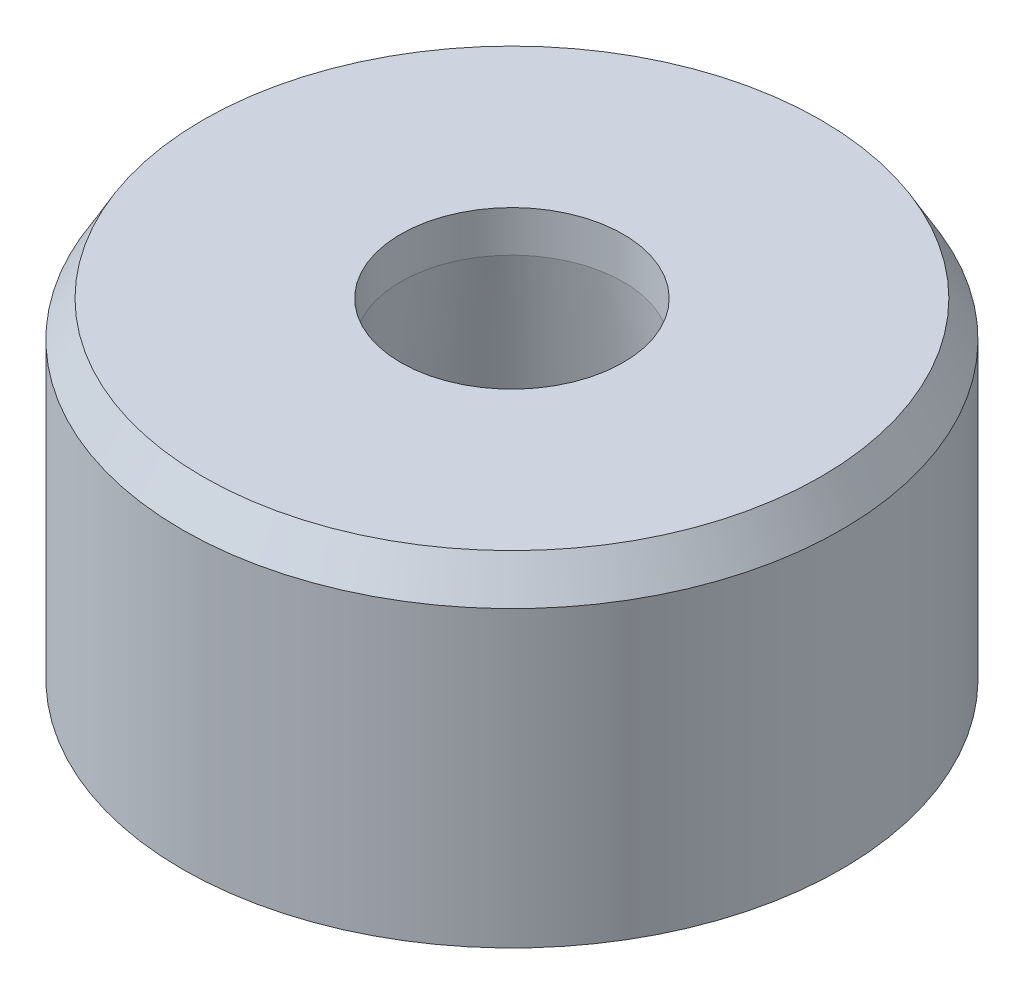
ISO-10303-21;
HEADER;
FILE_DESCRIPTION(('STEP AP214'),'2;1');
FILE_NAME('part.step','',(''),(''),'','','');
FILE_SCHEMA(('AUTOMOTIVE_DESIGN { 1 0 10303 214 1 1 1 1 }'));
ENDSEC;
DATA;
#1=APPLICATION_CONTEXT('core data for automotive mechanical design processes');
#2=APPLICATION_PROTOCOL_DEFINITION('international standard','automotive_design',2000,#1);
#3=PRODUCT_CONTEXT('',#1,'mechanical');
#4=PRODUCT('Part','Part','',(#3));
#5=PRODUCT_RELATED_PRODUCT_CATEGORY('part','',(#4));
#6=PRODUCT_DEFINITION_FORMATION('','',#4);
#7=PRODUCT_DEFINITION_CONTEXT('part definition',#1,'design');
#8=PRODUCT_DEFINITION('design','',#6,#7);
#9=PRODUCT_DEFINITION_SHAPE('','',#8);
#10=(LENGTH_UNIT() NAMED_UNIT(*) SI_UNIT(.MILLI.,.METRE.));
#11=(NAMED_UNIT(*) PLANE_ANGLE_UNIT() SI_UNIT($,.RADIAN.));
#12=(NAMED_UNIT(*) SI_UNIT($,.STERADIAN.) SOLID_ANGLE_UNIT());
#13=UNCERTAINTY_MEASURE_WITH_UNIT(LENGTH_MEASURE(1.E-05),#10,'distance_accuracy_value','');
#14=(GEOMETRIC_REPRESENTATION_CONTEXT(3) GLOBAL_UNCERTAINTY_ASSIGNED_CONTEXT((#13)) GLOBAL_UNIT_ASSIGNED_CONTEXT((#10,
#11,#12)) REPRESENTATION_CONTEXT('',''));
#15=CARTESIAN_POINT('',(0.,0.,0.));
#16=DIRECTION('',(0.,0.,1.));
#17=DIRECTION('',(1.,0.,0.));
#18=AXIS2_PLACEMENT_3D('',#15,#16,#17);
#19=CARTESIAN_POINT('',(0.,8.,0.));
#20=DIRECTION('',(0.,1.,0.));
#21=DIRECTION('',(0.,0.,1.));
#22=AXIS2_PLACEMENT_3D('',#19,#20,#21);
#23=PLANE('',#22);
#24=CARTESIAN_POINT('',(0.,8.,0.));
#25=DIRECTION('',(0.,1.,0.));
#26=DIRECTION('',(0.,0.,1.));
#27=AXIS2_PLACEMENT_3D('',#24,#25,#26);
#28=CIRCLE('',#27,7.5);
#29=CARTESIAN_POINT('',(0.,8.,7.5));
#30=VERTEX_POINT('',#29);
#31=EDGE_CURVE('E42',#30,#30,#28,.T.);
#32=ORIENTED_EDGE('',*,*,#31,.T.);
#33=EDGE_LOOP('',(#32));
#34=FACE_BOUND('',#33,.T.);
#35=CARTESIAN_POINT('',(0.,8.,0.));
#36=DIRECTION('',(0.,1.,0.));
#37=DIRECTION('',(0.,0.,1.));
#38=AXIS2_PLACEMENT_3D('',#35,#36,#37);
#39=CIRCLE('',#38,2.7);
#40=CARTESIAN_POINT('',(0.,8.,2.7));
#41=VERTEX_POINT('',#40);
#42=EDGE_CURVE('E58',#41,#41,#39,.T.);
#43=ORIENTED_EDGE('',*,*,#42,.F.);
#44=EDGE_LOOP('',(#43));
#45=FACE_BOUND('',#44,.T.);
#46=ADVANCED_FACE('F35',(#34,#45),#23,.T.);
#47=CARTESIAN_POINT('',(0.,0.,0.));
#48=DIRECTION('',(0.,1.,0.));
#49=DIRECTION('',(0.,0.,1.));
#50=AXIS2_PLACEMENT_3D('',#47,#48,#49);
#51=PLANE('',#50);
#52=CARTESIAN_POINT('',(0.,0.,0.));
#53=DIRECTION('',(0.,1.,0.));
#54=DIRECTION('',(0.,0.,1.));
#55=AXIS2_PLACEMENT_3D('',#52,#53,#54);
#56=CIRCLE('',#55,3.68378584291674);
#57=CARTESIAN_POINT('',(0.,0.,3.68378584291674));
#58=VERTEX_POINT('',#57);
#59=EDGE_CURVE('E50',#58,#58,#56,.T.);
#60=ORIENTED_EDGE('',*,*,#59,.T.);
#61=EDGE_LOOP('',(#60));
#62=FACE_BOUND('',#61,.T.);
#63=CARTESIAN_POINT('',(0.,0.,0.));
#64=DIRECTION('',(0.,1.,0.));
#65=DIRECTION('',(0.,0.,1.));
#66=AXIS2_PLACEMENT_3D('',#63,#64,#65);
#67=CIRCLE('',#66,8.);
#68=CARTESIAN_POINT('',(0.,0.,8.));
#69=VERTEX_POINT('',#68);
#70=EDGE_CURVE('E55',#69,#69,#67,.T.);
#71=ORIENTED_EDGE('',*,*,#70,.F.);
#72=EDGE_LOOP('',(#71));
#73=FACE_BOUND('',#72,.T.);
#74=ADVANCED_FACE('F65',(#62,#73),#51,.F.);
#75=CARTESIAN_POINT('',(0.,8.,0.));
#76=DIRECTION('',(0.,-1.,0.));
#77=DIRECTION('',(0.,0.,-1.));
#78=AXIS2_PLACEMENT_3D('',#75,#76,#77);
#79=CYLINDRICAL_SURFACE('',#78,8.);
#80=CARTESIAN_POINT('',(0.,7.13397459621556,0.));
#81=DIRECTION('',(0.,1.,0.));
#82=DIRECTION('',(0.,0.,1.));
#83=AXIS2_PLACEMENT_3D('',#80,#81,#82);
#84=CIRCLE('',#83,8.);
#85=CARTESIAN_POINT('',(0.,7.13397459621556,8.));
#86=VERTEX_POINT('',#85);
#87=EDGE_CURVE('E10',#86,#86,#84,.F.);
#88=ORIENTED_EDGE('',*,*,#87,.T.);
#89=EDGE_LOOP('',(#88));
#90=FACE_BOUND('',#89,.T.);
#91=ORIENTED_EDGE('',*,*,#70,.T.);
#92=EDGE_LOOP('',(#91));
#93=FACE_BOUND('',#92,.T.);
#94=ADVANCED_FACE('F72',(#90,#93),#79,.T.);
#95=CARTESIAN_POINT('',(0.,8.,0.));
#96=DIRECTION('',(0.,-1.,0.));
#97=DIRECTION('',(0.,0.,-1.));
#98=AXIS2_PLACEMENT_3D('',#95,#96,#97);
#99=CYLINDRICAL_SURFACE('',#98,2.7);
#100=CARTESIAN_POINT('',(0.,7.00000000000012,0.));
#101=DIRECTION('',(0.,1.,0.));
#102=DIRECTION('',(0.,0.,1.));
#103=AXIS2_PLACEMENT_3D('',#100,#101,#102);
#104=CIRCLE('',#103,2.7);
#105=CARTESIAN_POINT('',(0.,7.00000000000012,2.7));
#106=VERTEX_POINT('',#105);
#107=EDGE_CURVE('E46',#106,#106,#104,.F.);
#108=ORIENTED_EDGE('',*,*,#107,.T.);
#109=EDGE_LOOP('',(#108));
#110=FACE_BOUND('',#109,.T.);
#111=ORIENTED_EDGE('',*,*,#42,.T.);
#112=EDGE_LOOP('',(#111));
#113=FACE_BOUND('',#112,.T.);
#114=ADVANCED_FACE('F62',(#110,#113),#99,.F.);
#115=CARTESIAN_POINT('',(0.,0.,0.));
#116=DIRECTION('',(0.,-1.,0.));
#117=DIRECTION('',(0.,0.,-1.));
#118=AXIS2_PLACEMENT_3D('',#115,#116,#117);
#119=CONICAL_SURFACE('',#118,3.68378584291674,0.139626340159543);
#120=ORIENTED_EDGE('',*,*,#107,.F.);
#121=EDGE_LOOP('',(#120));
#122=FACE_BOUND('',#121,.T.);
#123=ORIENTED_EDGE('',*,*,#59,.F.);
#124=EDGE_LOOP('',(#123));
#125=FACE_BOUND('',#124,.T.);
#126=ADVANCED_FACE('F77',(#122,#125),#119,.F.);
#127=CARTESIAN_POINT('',(0.,8.,0.));
#128=DIRECTION('',(0.,-1.,0.));
#129=DIRECTION('',(0.,0.,-1.));
#130=AXIS2_PLACEMENT_3D('',#127,#128,#129);
#131=CONICAL_SURFACE('',#130,7.5,0.5235987755983);
#132=ORIENTED_EDGE('',*,*,#87,.F.);
#133=EDGE_LOOP('',(#132));
#134=FACE_BOUND('',#133,.T.);
#135=ORIENTED_EDGE('',*,*,#31,.F.);
#136=EDGE_LOOP('',(#135));
#137=FACE_BOUND('',#136,.T.);
#138=ADVANCED_FACE('F37',(#134,#137),#131,.T.);
#139=CLOSED_SHELL('',(#46,#74,#94,#114,#126,#138));
#140=MANIFOLD_SOLID_BREP('B2',#139);
#141=ADVANCED_BREP_SHAPE_REPRESENTATION('',(#18,#140),#14);
#142=SHAPE_DEFINITION_REPRESENTATION(#9,#141);
ENDSEC;
END-ISO-10303-21;
